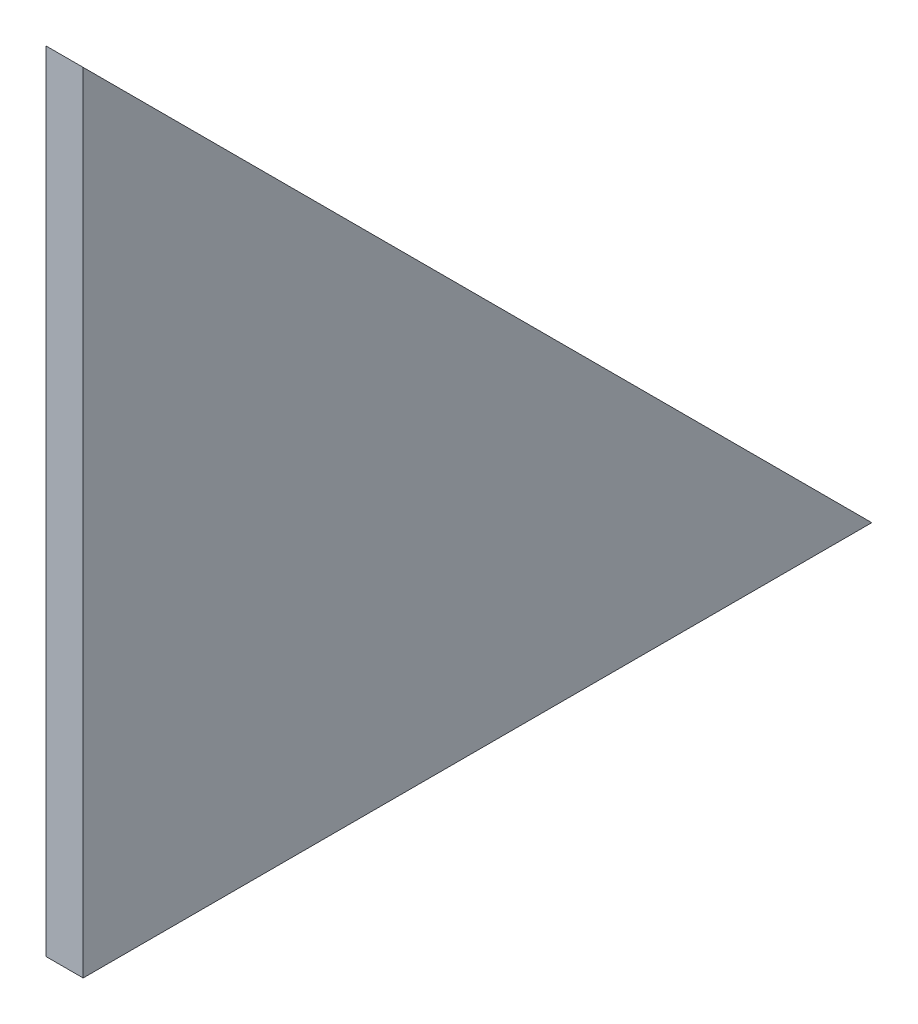
ISO-10303-21;
HEADER;
FILE_DESCRIPTION(('STEP AP214'),'2;1');
FILE_NAME('part.step','',(''),(''),'','','');
FILE_SCHEMA(('AUTOMOTIVE_DESIGN { 1 0 10303 214 1 1 1 1 }'));
ENDSEC;
DATA;
#1=APPLICATION_CONTEXT('core data for automotive mechanical design processes');
#2=APPLICATION_PROTOCOL_DEFINITION('international standard','automotive_design',2000,#1);
#3=PRODUCT_CONTEXT('',#1,'mechanical');
#4=PRODUCT('Part','Part','',(#3));
#5=PRODUCT_RELATED_PRODUCT_CATEGORY('part','',(#4));
#6=PRODUCT_DEFINITION_FORMATION('','',#4);
#7=PRODUCT_DEFINITION_CONTEXT('part definition',#1,'design');
#8=PRODUCT_DEFINITION('design','',#6,#7);
#9=PRODUCT_DEFINITION_SHAPE('','',#8);
#10=(LENGTH_UNIT() NAMED_UNIT(*) SI_UNIT(.MILLI.,.METRE.));
#11=(NAMED_UNIT(*) PLANE_ANGLE_UNIT() SI_UNIT($,.RADIAN.));
#12=(NAMED_UNIT(*) SI_UNIT($,.STERADIAN.) SOLID_ANGLE_UNIT());
#13=UNCERTAINTY_MEASURE_WITH_UNIT(LENGTH_MEASURE(1.E-05),#10,'distance_accuracy_value','');
#14=(GEOMETRIC_REPRESENTATION_CONTEXT(3) GLOBAL_UNCERTAINTY_ASSIGNED_CONTEXT((#13)) GLOBAL_UNIT_ASSIGNED_CONTEXT((#10,
#11,#12)) REPRESENTATION_CONTEXT('',''));
#15=CARTESIAN_POINT('',(0.,0.,0.));
#16=DIRECTION('',(0.,0.,1.));
#17=DIRECTION('',(1.,0.,0.));
#18=AXIS2_PLACEMENT_3D('',#15,#16,#17);
#19=CARTESIAN_POINT('',(11.90625,-2.22044604925031E-13,-254.));
#20=DIRECTION('',(0.,0.999999999999995,0.));
#21=DIRECTION('',(0.,0.,0.999999999999998));
#22=AXIS2_PLACEMENT_3D('',#19,#20,#21);
#23=PLANE('',#22);
#24=DIRECTION('',(0.,0.,-0.999999999999998));
#25=VECTOR('',#24,1.);
#26=CARTESIAN_POINT('',(0.,-2.22044604925031E-13,-254.));
#27=LINE('',#26,#25);
#28=CARTESIAN_POINT('',(0.,0.,0.));
#29=VERTEX_POINT('',#28);
#30=CARTESIAN_POINT('',(0.,-2.22044604925031E-13,-254.));
#31=VERTEX_POINT('',#30);
#32=EDGE_CURVE('E77',#29,#31,#27,.T.);
#33=ORIENTED_EDGE('',*,*,#32,.T.);
#34=DIRECTION('',(-1.,0.,0.));
#35=VECTOR('',#34,1.);
#36=CARTESIAN_POINT('',(11.90625,-2.22044604925031E-13,-254.));
#37=LINE('',#36,#35);
#38=CARTESIAN_POINT('',(11.90625,-2.22044604925031E-13,-254.));
#39=VERTEX_POINT('',#38);
#40=EDGE_CURVE('E11',#39,#31,#37,.T.);
#41=ORIENTED_EDGE('',*,*,#40,.F.);
#42=DIRECTION('',(0.,0.,-0.999999999999998));
#43=VECTOR('',#42,1.);
#44=CARTESIAN_POINT('',(11.90625,-2.22044604925031E-13,-254.));
#45=LINE('',#44,#43);
#46=CARTESIAN_POINT('',(11.90625,0.,0.));
#47=VERTEX_POINT('',#46);
#48=EDGE_CURVE('E70',#47,#39,#45,.T.);
#49=ORIENTED_EDGE('',*,*,#48,.F.);
#50=DIRECTION('',(-1.,0.,0.));
#51=VECTOR('',#50,1.);
#52=CARTESIAN_POINT('',(11.90625,0.,0.));
#53=LINE('',#52,#51);
#54=EDGE_CURVE('E78',#47,#29,#53,.T.);
#55=ORIENTED_EDGE('',*,*,#54,.T.);
#56=EDGE_LOOP('',(#33,#41,#49,#55));
#57=FACE_BOUND('',#56,.T.);
#58=ADVANCED_FACE('F30',(#57),#23,.F.);
#59=CARTESIAN_POINT('',(11.9062500000008,254.,0.));
#60=DIRECTION('',(0.,-0.707106781186544,0.707106781186546));
#61=DIRECTION('',(0.,-0.707106781186544,-0.707106781186546));
#62=AXIS2_PLACEMENT_3D('',#59,#60,#61);
#63=PLANE('',#62);
#64=DIRECTION('',(0.,0.707106781186544,0.707106781186546));
#65=VECTOR('',#64,1.);
#66=CARTESIAN_POINT('',(7.7715611723761E-13,254.,0.));
#67=LINE('',#66,#65);
#68=CARTESIAN_POINT('',(7.7715611723761E-13,254.,0.));
#69=VERTEX_POINT('',#68);
#70=EDGE_CURVE('E58',#31,#69,#67,.T.);
#71=ORIENTED_EDGE('',*,*,#70,.T.);
#72=DIRECTION('',(-1.,0.,0.));
#73=VECTOR('',#72,1.);
#74=CARTESIAN_POINT('',(11.9062500000008,254.,0.));
#75=LINE('',#74,#73);
#76=CARTESIAN_POINT('',(11.9062500000008,254.,0.));
#77=VERTEX_POINT('',#76);
#78=EDGE_CURVE('E38',#77,#69,#75,.T.);
#79=ORIENTED_EDGE('',*,*,#78,.F.);
#80=DIRECTION('',(0.,0.707106781186544,0.707106781186546));
#81=VECTOR('',#80,1.);
#82=CARTESIAN_POINT('',(11.9062500000008,254.,0.));
#83=LINE('',#82,#81);
#84=EDGE_CURVE('E66',#39,#77,#83,.T.);
#85=ORIENTED_EDGE('',*,*,#84,.F.);
#86=ORIENTED_EDGE('',*,*,#40,.T.);
#87=EDGE_LOOP('',(#71,#79,#85,#86));
#88=FACE_BOUND('',#87,.T.);
#89=ADVANCED_FACE('F67',(#88),#63,.F.);
#90=CARTESIAN_POINT('',(11.90625,0.,0.));
#91=DIRECTION('',(0.,0.,-0.999999999999998));
#92=DIRECTION('',(-1.,0.,0.));
#93=AXIS2_PLACEMENT_3D('',#90,#91,#92);
#94=PLANE('',#93);
#95=DIRECTION('',(0.,-0.999999999999995,0.));
#96=VECTOR('',#95,1.);
#97=CARTESIAN_POINT('',(0.,0.,0.));
#98=LINE('',#97,#96);
#99=EDGE_CURVE('E63',#69,#29,#98,.T.);
#100=ORIENTED_EDGE('',*,*,#99,.T.);
#101=ORIENTED_EDGE('',*,*,#54,.F.);
#102=DIRECTION('',(0.,-0.999999999999995,0.));
#103=VECTOR('',#102,1.);
#104=CARTESIAN_POINT('',(11.90625,0.,0.));
#105=LINE('',#104,#103);
#106=EDGE_CURVE('E46',#77,#47,#105,.T.);
#107=ORIENTED_EDGE('',*,*,#106,.F.);
#108=ORIENTED_EDGE('',*,*,#78,.T.);
#109=EDGE_LOOP('',(#100,#101,#107,#108));
#110=FACE_BOUND('',#109,.T.);
#111=ADVANCED_FACE('F85',(#110),#94,.F.);
#112=CARTESIAN_POINT('',(11.90625,0.,0.));
#113=DIRECTION('',(-1.,0.,0.));
#114=DIRECTION('',(0.,0.,0.999999999999998));
#115=AXIS2_PLACEMENT_3D('',#112,#113,#114);
#116=PLANE('',#115);
#117=ORIENTED_EDGE('',*,*,#48,.T.);
#118=ORIENTED_EDGE('',*,*,#84,.T.);
#119=ORIENTED_EDGE('',*,*,#106,.T.);
#120=EDGE_LOOP('',(#117,#118,#119));
#121=FACE_BOUND('',#120,.T.);
#122=ADVANCED_FACE('F73',(#121),#116,.F.);
#123=CARTESIAN_POINT('',(0.,0.,0.));
#124=DIRECTION('',(-1.,0.,0.));
#125=DIRECTION('',(0.,0.,0.999999999999998));
#126=AXIS2_PLACEMENT_3D('',#123,#124,#125);
#127=PLANE('',#126);
#128=ORIENTED_EDGE('',*,*,#32,.F.);
#129=ORIENTED_EDGE('',*,*,#99,.F.);
#130=ORIENTED_EDGE('',*,*,#70,.F.);
#131=EDGE_LOOP('',(#128,#129,#130));
#132=FACE_BOUND('',#131,.T.);
#133=ADVANCED_FACE('F86',(#132),#127,.T.);
#134=CLOSED_SHELL('',(#58,#89,#111,#122,#133));
#135=MANIFOLD_SOLID_BREP('B2',#134);
#136=ADVANCED_BREP_SHAPE_REPRESENTATION('',(#18,#135),#14);
#137=SHAPE_DEFINITION_REPRESENTATION(#9,#136);
ENDSEC;
END-ISO-10303-21;
